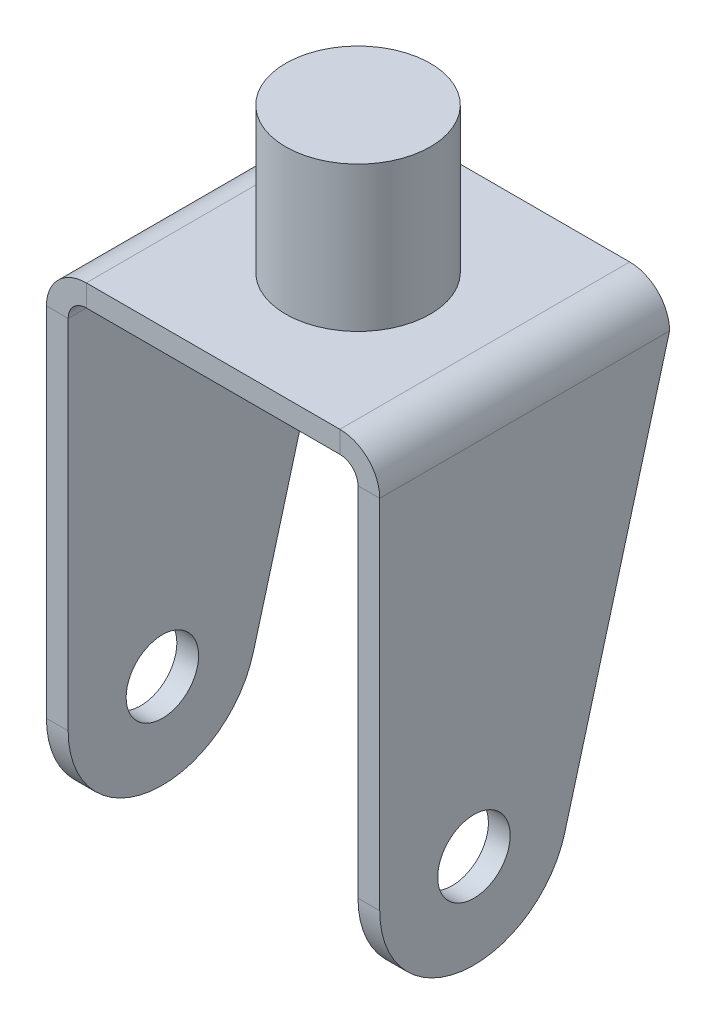
ISO-10303-21;
HEADER;
FILE_DESCRIPTION(('STEP AP214'),'2;1');
FILE_NAME('part.step','',(''),(''),'','','');
FILE_SCHEMA(('AUTOMOTIVE_DESIGN { 1 0 10303 214 1 1 1 1 }'));
ENDSEC;
DATA;
#1=APPLICATION_CONTEXT('core data for automotive mechanical design processes');
#2=APPLICATION_PROTOCOL_DEFINITION('international standard','automotive_design',2000,#1);
#3=PRODUCT_CONTEXT('',#1,'mechanical');
#4=PRODUCT('Part','Part','',(#3));
#5=PRODUCT_RELATED_PRODUCT_CATEGORY('part','',(#4));
#6=PRODUCT_DEFINITION_FORMATION('','',#4);
#7=PRODUCT_DEFINITION_CONTEXT('part definition',#1,'design');
#8=PRODUCT_DEFINITION('design','',#6,#7);
#9=PRODUCT_DEFINITION_SHAPE('','',#8);
#10=(LENGTH_UNIT() NAMED_UNIT(*) SI_UNIT(.MILLI.,.METRE.));
#11=(NAMED_UNIT(*) PLANE_ANGLE_UNIT() SI_UNIT($,.RADIAN.));
#12=(NAMED_UNIT(*) SI_UNIT($,.STERADIAN.) SOLID_ANGLE_UNIT());
#13=UNCERTAINTY_MEASURE_WITH_UNIT(LENGTH_MEASURE(1.E-05),#10,'distance_accuracy_value','');
#14=(GEOMETRIC_REPRESENTATION_CONTEXT(3) GLOBAL_UNCERTAINTY_ASSIGNED_CONTEXT((#13)) GLOBAL_UNIT_ASSIGNED_CONTEXT((#10,
#11,#12)) REPRESENTATION_CONTEXT('',''));
#15=CARTESIAN_POINT('',(0.,0.,0.));
#16=DIRECTION('',(0.,0.,1.));
#17=DIRECTION('',(1.,0.,0.));
#18=AXIS2_PLACEMENT_3D('',#15,#16,#17);
#19=CARTESIAN_POINT('',(50.8,0.,50.8));
#20=DIRECTION('',(1.,0.,0.));
#21=DIRECTION('',(0.,0.,-1.));
#22=AXIS2_PLACEMENT_3D('',#19,#20,#21);
#23=PLANE('',#22);
#24=CARTESIAN_POINT('',(50.8,33.02,17.78));
#25=DIRECTION('',(1.,0.,0.));
#26=DIRECTION('',(0.,0.,-1.));
#27=AXIS2_PLACEMENT_3D('',#24,#25,#26);
#28=CIRCLE('',#27,33.02);
#29=CARTESIAN_POINT('',(50.8,24.2870464916257,-14.0642447393649));
#30=VERTEX_POINT('',#29);
#31=CARTESIAN_POINT('',(50.8,33.02,50.8));
#32=VERTEX_POINT('',#31);
#33=EDGE_CURVE('E189',#30,#32,#28,.F.);
#34=ORIENTED_EDGE('',*,*,#33,.T.);
#35=DIRECTION('',(0.,-1.,0.));
#36=VECTOR('',#35,1.);
#37=CARTESIAN_POINT('',(50.8,0.,50.8));
#38=LINE('',#37,#36);
#39=CARTESIAN_POINT('',(50.8,158.242,50.8));
#40=VERTEX_POINT('',#39);
#41=EDGE_CURVE('E200',#40,#32,#38,.T.);
#42=ORIENTED_EDGE('',*,*,#41,.F.);
#43=DIRECTION('',(0.,0.,-1.));
#44=VECTOR('',#43,1.);
#45=CARTESIAN_POINT('',(50.8,158.242,50.8));
#46=LINE('',#45,#44);
#47=CARTESIAN_POINT('',(50.8,158.242,-50.8));
#48=VERTEX_POINT('',#47);
#49=EDGE_CURVE('E181',#40,#48,#46,.T.);
#50=ORIENTED_EDGE('',*,*,#49,.T.);
#51=DIRECTION('',(0.,-0.964392632930495,0.264474667122178));
#52=VECTOR('',#51,1.);
#53=CARTESIAN_POINT('',(50.8,-14.8453045634543,-3.33260374004345));
#54=LINE('',#53,#52);
#55=EDGE_CURVE('E281',#48,#30,#54,.T.);
#56=ORIENTED_EDGE('',*,*,#55,.T.);
#57=EDGE_LOOP('',(#34,#42,#50,#56));
#58=FACE_BOUND('',#57,.T.);
#59=CARTESIAN_POINT('',(50.8,33.02,17.78));
#60=DIRECTION('',(1.,0.,0.));
#61=DIRECTION('',(0.,0.,-1.));
#62=AXIS2_PLACEMENT_3D('',#59,#60,#61);
#63=CIRCLE('',#62,12.7);
#64=CARTESIAN_POINT('',(50.8,33.02,5.08000000000002));
#65=VERTEX_POINT('',#64);
#66=EDGE_CURVE('E260',#65,#65,#63,.T.);
#67=ORIENTED_EDGE('',*,*,#66,.T.);
#68=EDGE_LOOP('',(#67));
#69=FACE_BOUND('',#68,.T.);
#70=ADVANCED_FACE('F66',(#58,#69),#23,.F.);
#71=CARTESIAN_POINT('',(58.42,0.,50.8));
#72=DIRECTION('',(1.,0.,0.));
#73=DIRECTION('',(0.,0.,-1.));
#74=AXIS2_PLACEMENT_3D('',#71,#72,#73);
#75=PLANE('',#74);
#76=DIRECTION('',(0.,1.,0.));
#77=VECTOR('',#76,1.);
#78=CARTESIAN_POINT('',(58.42,0.,50.8));
#79=LINE('',#78,#77);
#80=CARTESIAN_POINT('',(58.42,158.242,50.8));
#81=VERTEX_POINT('',#80);
#82=CARTESIAN_POINT('',(58.42,33.02,50.8));
#83=VERTEX_POINT('',#82);
#84=EDGE_CURVE('E287',#81,#83,#79,.F.);
#85=ORIENTED_EDGE('',*,*,#84,.T.);
#86=CARTESIAN_POINT('',(58.42,33.02,17.78));
#87=DIRECTION('',(1.,0.,0.));
#88=DIRECTION('',(0.,0.,-1.));
#89=AXIS2_PLACEMENT_3D('',#86,#87,#88);
#90=CIRCLE('',#89,33.02);
#91=CARTESIAN_POINT('',(58.42,24.2870464916257,-14.0642447393649));
#92=VERTEX_POINT('',#91);
#93=EDGE_CURVE('E272',#92,#83,#90,.F.);
#94=ORIENTED_EDGE('',*,*,#93,.F.);
#95=DIRECTION('',(0.,-0.964392632930495,0.264474667122178));
#96=VECTOR('',#95,1.);
#97=CARTESIAN_POINT('',(58.42,-1.88838759853009,-6.8859036971523));
#98=LINE('',#97,#96);
#99=CARTESIAN_POINT('',(58.42,158.242,-50.8));
#100=VERTEX_POINT('',#99);
#101=EDGE_CURVE('E82',#100,#92,#98,.T.);
#102=ORIENTED_EDGE('',*,*,#101,.F.);
#103=DIRECTION('',(0.,0.,-1.));
#104=VECTOR('',#103,1.);
#105=CARTESIAN_POINT('',(58.42,158.242,50.8));
#106=LINE('',#105,#104);
#107=EDGE_CURVE('E214',#81,#100,#106,.T.);
#108=ORIENTED_EDGE('',*,*,#107,.F.);
#109=EDGE_LOOP('',(#85,#94,#102,#108));
#110=FACE_BOUND('',#109,.T.);
#111=CARTESIAN_POINT('',(58.42,33.02,17.78));
#112=DIRECTION('',(1.,0.,0.));
#113=DIRECTION('',(0.,0.,-1.));
#114=AXIS2_PLACEMENT_3D('',#111,#112,#113);
#115=CIRCLE('',#114,12.7);
#116=CARTESIAN_POINT('',(58.42,33.02,5.08000000000002));
#117=VERTEX_POINT('',#116);
#118=EDGE_CURVE('E262',#117,#117,#115,.T.);
#119=ORIENTED_EDGE('',*,*,#118,.F.);
#120=EDGE_LOOP('',(#119));
#121=FACE_BOUND('',#120,.T.);
#122=ADVANCED_FACE('F328',(#110,#121),#75,.T.);
#123=CARTESIAN_POINT('',(-58.42,0.,50.8));
#124=DIRECTION('',(-1.,0.,0.));
#125=DIRECTION('',(0.,0.,1.));
#126=AXIS2_PLACEMENT_3D('',#123,#124,#125);
#127=PLANE('',#126);
#128=CARTESIAN_POINT('',(-58.42,33.02,17.78));
#129=DIRECTION('',(1.,0.,0.));
#130=DIRECTION('',(0.,0.,-1.));
#131=AXIS2_PLACEMENT_3D('',#128,#129,#130);
#132=CIRCLE('',#131,33.02);
#133=CARTESIAN_POINT('',(-58.42,24.2870464916257,-14.0642447393649));
#134=VERTEX_POINT('',#133);
#135=CARTESIAN_POINT('',(-58.42,33.02,50.8));
#136=VERTEX_POINT('',#135);
#137=EDGE_CURVE('E271',#134,#136,#132,.F.);
#138=ORIENTED_EDGE('',*,*,#137,.T.);
#139=DIRECTION('',(0.,1.,0.));
#140=VECTOR('',#139,1.);
#141=CARTESIAN_POINT('',(-58.42,0.,50.8));
#142=LINE('',#141,#140);
#143=CARTESIAN_POINT('',(-58.42,158.242,50.8));
#144=VERTEX_POINT('',#143);
#145=EDGE_CURVE('E256',#136,#144,#142,.T.);
#146=ORIENTED_EDGE('',*,*,#145,.T.);
#147=DIRECTION('',(0.,0.,-1.));
#148=VECTOR('',#147,1.);
#149=CARTESIAN_POINT('',(-58.42,158.242,50.8));
#150=LINE('',#149,#148);
#151=CARTESIAN_POINT('',(-58.42,158.242,-50.8));
#152=VERTEX_POINT('',#151);
#153=EDGE_CURVE('E205',#144,#152,#150,.T.);
#154=ORIENTED_EDGE('',*,*,#153,.T.);
#155=DIRECTION('',(0.,-0.964392632930495,0.264474667122178));
#156=VECTOR('',#155,1.);
#157=CARTESIAN_POINT('',(-58.42,-1.88838759853009,-6.8859036971523));
#158=LINE('',#157,#156);
#159=EDGE_CURVE('E268',#152,#134,#158,.T.);
#160=ORIENTED_EDGE('',*,*,#159,.T.);
#161=EDGE_LOOP('',(#138,#146,#154,#160));
#162=FACE_BOUND('',#161,.T.);
#163=CARTESIAN_POINT('',(-58.42,33.02,17.78));
#164=DIRECTION('',(1.,0.,0.));
#165=DIRECTION('',(0.,0.,-1.));
#166=AXIS2_PLACEMENT_3D('',#163,#164,#165);
#167=CIRCLE('',#166,12.7);
#168=CARTESIAN_POINT('',(-58.42,33.02,5.08000000000002));
#169=VERTEX_POINT('',#168);
#170=EDGE_CURVE('E257',#169,#169,#167,.T.);
#171=ORIENTED_EDGE('',*,*,#170,.T.);
#172=EDGE_LOOP('',(#171));
#173=FACE_BOUND('',#172,.T.);
#174=ADVANCED_FACE('F297',(#162,#173),#127,.T.);
#175=CARTESIAN_POINT('',(-50.8,0.,50.8));
#176=DIRECTION('',(-1.,0.,0.));
#177=DIRECTION('',(0.,0.,1.));
#178=AXIS2_PLACEMENT_3D('',#175,#176,#177);
#179=PLANE('',#178);
#180=DIRECTION('',(0.,1.,0.));
#181=VECTOR('',#180,1.);
#182=CARTESIAN_POINT('',(-50.8,0.,50.8));
#183=LINE('',#182,#181);
#184=CARTESIAN_POINT('',(-50.8,33.02,50.8));
#185=VERTEX_POINT('',#184);
#186=CARTESIAN_POINT('',(-50.8,158.242,50.8));
#187=VERTEX_POINT('',#186);
#188=EDGE_CURVE('E164',#185,#187,#183,.T.);
#189=ORIENTED_EDGE('',*,*,#188,.F.);
#190=CARTESIAN_POINT('',(-50.8,33.02,17.78));
#191=DIRECTION('',(-1.,0.,0.));
#192=DIRECTION('',(0.,0.,1.));
#193=AXIS2_PLACEMENT_3D('',#190,#191,#192);
#194=CIRCLE('',#193,33.02);
#195=CARTESIAN_POINT('',(-50.8,24.2870464916257,-14.0642447393649));
#196=VERTEX_POINT('',#195);
#197=EDGE_CURVE('E75',#185,#196,#194,.F.);
#198=ORIENTED_EDGE('',*,*,#197,.T.);
#199=DIRECTION('',(0.,0.964392632930495,-0.264474667122178));
#200=VECTOR('',#199,1.);
#201=CARTESIAN_POINT('',(-50.8,-14.8453045634543,-3.33260374004345));
#202=LINE('',#201,#200);
#203=CARTESIAN_POINT('',(-50.8,158.242,-50.8));
#204=VERTEX_POINT('',#203);
#205=EDGE_CURVE('E238',#196,#204,#202,.T.);
#206=ORIENTED_EDGE('',*,*,#205,.T.);
#207=DIRECTION('',(0.,0.,-1.));
#208=VECTOR('',#207,1.);
#209=CARTESIAN_POINT('',(-50.8,158.242,50.8));
#210=LINE('',#209,#208);
#211=EDGE_CURVE('E173',#187,#204,#210,.T.);
#212=ORIENTED_EDGE('',*,*,#211,.F.);
#213=EDGE_LOOP('',(#189,#198,#206,#212));
#214=FACE_BOUND('',#213,.T.);
#215=CARTESIAN_POINT('',(-50.8,33.02,17.78));
#216=DIRECTION('',(-1.,0.,0.));
#217=DIRECTION('',(0.,0.,1.));
#218=AXIS2_PLACEMENT_3D('',#215,#216,#217);
#219=CIRCLE('',#218,12.7);
#220=CARTESIAN_POINT('',(-50.8,33.02,30.48));
#221=VERTEX_POINT('',#220);
#222=EDGE_CURVE('E70',#221,#221,#219,.T.);
#223=ORIENTED_EDGE('',*,*,#222,.T.);
#224=EDGE_LOOP('',(#223));
#225=FACE_BOUND('',#224,.T.);
#226=ADVANCED_FACE('F234',(#214,#225),#179,.F.);
#227=CARTESIAN_POINT('',(44.45,164.592,50.8));
#228=DIRECTION('',(0.,0.,1.));
#229=DIRECTION('',(1.,0.,0.));
#230=AXIS2_PLACEMENT_3D('',#227,#228,#229);
#231=PLANE('',#230);
#232=DIRECTION('',(0.,1.,0.));
#233=VECTOR('',#232,1.);
#234=CARTESIAN_POINT('',(44.45,164.592,50.8));
#235=LINE('',#234,#233);
#236=CARTESIAN_POINT('',(44.45,164.592,50.8));
#237=VERTEX_POINT('',#236);
#238=CARTESIAN_POINT('',(44.45,172.212,50.8));
#239=VERTEX_POINT('',#238);
#240=EDGE_CURVE('E226',#237,#239,#235,.T.);
#241=ORIENTED_EDGE('',*,*,#240,.F.);
#242=CARTESIAN_POINT('',(44.45,158.242,50.8));
#243=DIRECTION('',(0.,0.,-1.));
#244=DIRECTION('',(-1.,0.,0.));
#245=AXIS2_PLACEMENT_3D('',#242,#243,#244);
#246=CIRCLE('',#245,6.35);
#247=EDGE_CURVE('E179',#237,#40,#246,.T.);
#248=ORIENTED_EDGE('',*,*,#247,.T.);
#249=DIRECTION('',(-1.,0.,0.));
#250=VECTOR('',#249,1.);
#251=CARTESIAN_POINT('',(58.42,158.242,50.8));
#252=LINE('',#251,#250);
#253=EDGE_CURVE('E91',#81,#40,#252,.T.);
#254=ORIENTED_EDGE('',*,*,#253,.F.);
#255=CARTESIAN_POINT('',(44.45,158.242,50.8));
#256=DIRECTION('',(0.,0.,1.));
#257=DIRECTION('',(1.,0.,0.));
#258=AXIS2_PLACEMENT_3D('',#255,#256,#257);
#259=CIRCLE('',#258,13.97);
#260=EDGE_CURVE('E290',#239,#81,#259,.F.);
#261=ORIENTED_EDGE('',*,*,#260,.F.);
#262=EDGE_LOOP('',(#241,#248,#254,#261));
#263=FACE_BOUND('',#262,.T.);
#264=ADVANCED_FACE('F68',(#263),#231,.T.);
#265=CARTESIAN_POINT('',(58.42,158.242,50.8));
#266=DIRECTION('',(0.,0.,1.));
#267=DIRECTION('',(1.,0.,0.));
#268=AXIS2_PLACEMENT_3D('',#265,#266,#267);
#269=PLANE('',#268);
#270=DIRECTION('',(1.,0.,0.));
#271=VECTOR('',#270,1.);
#272=CARTESIAN_POINT('',(50.8,164.592,50.8));
#273=LINE('',#272,#271);
#274=CARTESIAN_POINT('',(-44.45,164.592,50.8));
#275=VERTEX_POINT('',#274);
#276=EDGE_CURVE('E144',#275,#237,#273,.T.);
#277=ORIENTED_EDGE('',*,*,#276,.T.);
#278=ORIENTED_EDGE('',*,*,#240,.T.);
#279=DIRECTION('',(1.,0.,0.));
#280=VECTOR('',#279,1.);
#281=CARTESIAN_POINT('',(50.8,172.212,50.8));
#282=LINE('',#281,#280);
#283=CARTESIAN_POINT('',(-44.45,172.212,50.8));
#284=VERTEX_POINT('',#283);
#285=EDGE_CURVE('E147',#284,#239,#282,.T.);
#286=ORIENTED_EDGE('',*,*,#285,.F.);
#287=DIRECTION('',(0.,-1.,0.));
#288=VECTOR('',#287,1.);
#289=CARTESIAN_POINT('',(-44.45,172.212,50.8));
#290=LINE('',#289,#288);
#291=EDGE_CURVE('E140',#284,#275,#290,.T.);
#292=ORIENTED_EDGE('',*,*,#291,.T.);
#293=EDGE_LOOP('',(#277,#278,#286,#292));
#294=FACE_BOUND('',#293,.T.);
#295=ADVANCED_FACE('F142',(#294),#269,.T.);
#296=CARTESIAN_POINT('',(50.8,158.242,-50.8));
#297=DIRECTION('',(0.,0.,-1.));
#298=DIRECTION('',(-1.,0.,0.));
#299=AXIS2_PLACEMENT_3D('',#296,#297,#298);
#300=PLANE('',#299);
#301=DIRECTION('',(1.,0.,0.));
#302=VECTOR('',#301,1.);
#303=CARTESIAN_POINT('',(50.8,158.242,-50.8));
#304=LINE('',#303,#302);
#305=EDGE_CURVE('E223',#48,#100,#304,.T.);
#306=ORIENTED_EDGE('',*,*,#305,.F.);
#307=CARTESIAN_POINT('',(44.45,158.242,-50.8));
#308=DIRECTION('',(0.,0.,-1.));
#309=DIRECTION('',(-1.,0.,0.));
#310=AXIS2_PLACEMENT_3D('',#307,#308,#309);
#311=CIRCLE('',#310,6.35);
#312=CARTESIAN_POINT('',(44.45,164.592,-50.8));
#313=VERTEX_POINT('',#312);
#314=EDGE_CURVE('E197',#313,#48,#311,.T.);
#315=ORIENTED_EDGE('',*,*,#314,.F.);
#316=DIRECTION('',(0.,-1.,0.));
#317=VECTOR('',#316,1.);
#318=CARTESIAN_POINT('',(44.45,172.212,-50.8));
#319=LINE('',#318,#317);
#320=CARTESIAN_POINT('',(44.45,172.212,-50.8));
#321=VERTEX_POINT('',#320);
#322=EDGE_CURVE('E116',#321,#313,#319,.T.);
#323=ORIENTED_EDGE('',*,*,#322,.F.);
#324=CARTESIAN_POINT('',(44.45,158.242,-50.8));
#325=DIRECTION('',(0.,0.,1.));
#326=DIRECTION('',(1.,0.,0.));
#327=AXIS2_PLACEMENT_3D('',#324,#325,#326);
#328=CIRCLE('',#327,13.97);
#329=EDGE_CURVE('E185',#321,#100,#328,.F.);
#330=ORIENTED_EDGE('',*,*,#329,.T.);
#331=EDGE_LOOP('',(#306,#315,#323,#330));
#332=FACE_BOUND('',#331,.T.);
#333=ADVANCED_FACE('F336',(#332),#300,.T.);
#334=CARTESIAN_POINT('',(-50.8,158.242,50.8));
#335=DIRECTION('',(0.,0.,1.));
#336=DIRECTION('',(1.,0.,0.));
#337=AXIS2_PLACEMENT_3D('',#334,#335,#336);
#338=PLANE('',#337);
#339=DIRECTION('',(-1.,0.,0.));
#340=VECTOR('',#339,1.);
#341=CARTESIAN_POINT('',(-50.8,158.242,50.8));
#342=LINE('',#341,#340);
#343=EDGE_CURVE('E152',#187,#144,#342,.T.);
#344=ORIENTED_EDGE('',*,*,#343,.F.);
#345=CARTESIAN_POINT('',(-44.45,158.242,50.8));
#346=DIRECTION('',(0.,0.,-1.));
#347=DIRECTION('',(-1.,0.,0.));
#348=AXIS2_PLACEMENT_3D('',#345,#346,#347);
#349=CIRCLE('',#348,6.35);
#350=EDGE_CURVE('E157',#187,#275,#349,.T.);
#351=ORIENTED_EDGE('',*,*,#350,.T.);
#352=ORIENTED_EDGE('',*,*,#291,.F.);
#353=CARTESIAN_POINT('',(-44.45,158.242,50.8));
#354=DIRECTION('',(0.,0.,1.));
#355=DIRECTION('',(1.,0.,0.));
#356=AXIS2_PLACEMENT_3D('',#353,#354,#355);
#357=CIRCLE('',#356,13.97);
#358=EDGE_CURVE('E294',#144,#284,#357,.F.);
#359=ORIENTED_EDGE('',*,*,#358,.F.);
#360=EDGE_LOOP('',(#344,#351,#352,#359));
#361=FACE_BOUND('',#360,.T.);
#362=ADVANCED_FACE('F159',(#361),#338,.T.);
#363=CARTESIAN_POINT('',(-44.45,172.212,50.8));
#364=DIRECTION('',(0.,0.,1.));
#365=DIRECTION('',(1.,0.,0.));
#366=AXIS2_PLACEMENT_3D('',#363,#364,#365);
#367=PLANE('',#366);
#368=DIRECTION('',(1.,0.,0.));
#369=VECTOR('',#368,1.);
#370=CARTESIAN_POINT('',(-58.42,33.02,50.8));
#371=LINE('',#370,#369);
#372=EDGE_CURVE('E248',#136,#185,#371,.T.);
#373=ORIENTED_EDGE('',*,*,#372,.T.);
#374=ORIENTED_EDGE('',*,*,#188,.T.);
#375=ORIENTED_EDGE('',*,*,#343,.T.);
#376=ORIENTED_EDGE('',*,*,#145,.F.);
#377=EDGE_LOOP('',(#373,#374,#375,#376));
#378=FACE_BOUND('',#377,.T.);
#379=ADVANCED_FACE('F255',(#378),#367,.T.);
#380=CARTESIAN_POINT('',(-44.45,164.592,-50.8));
#381=DIRECTION('',(0.,0.,-1.));
#382=DIRECTION('',(-1.,0.,0.));
#383=AXIS2_PLACEMENT_3D('',#380,#381,#382);
#384=PLANE('',#383);
#385=DIRECTION('',(0.,1.,0.));
#386=VECTOR('',#385,1.);
#387=CARTESIAN_POINT('',(-44.45,164.592,-50.8));
#388=LINE('',#387,#386);
#389=CARTESIAN_POINT('',(-44.45,164.592,-50.8));
#390=VERTEX_POINT('',#389);
#391=CARTESIAN_POINT('',(-44.45,172.212,-50.8));
#392=VERTEX_POINT('',#391);
#393=EDGE_CURVE('E153',#390,#392,#388,.T.);
#394=ORIENTED_EDGE('',*,*,#393,.F.);
#395=CARTESIAN_POINT('',(-44.45,158.242,-50.8));
#396=DIRECTION('',(0.,0.,-1.));
#397=DIRECTION('',(-1.,0.,0.));
#398=AXIS2_PLACEMENT_3D('',#395,#396,#397);
#399=CIRCLE('',#398,6.35);
#400=EDGE_CURVE('E171',#204,#390,#399,.T.);
#401=ORIENTED_EDGE('',*,*,#400,.F.);
#402=DIRECTION('',(1.,0.,0.));
#403=VECTOR('',#402,1.);
#404=CARTESIAN_POINT('',(-58.42,158.242,-50.8));
#405=LINE('',#404,#403);
#406=EDGE_CURVE('E217',#152,#204,#405,.T.);
#407=ORIENTED_EDGE('',*,*,#406,.F.);
#408=CARTESIAN_POINT('',(-44.45,158.242,-50.8));
#409=DIRECTION('',(0.,0.,1.));
#410=DIRECTION('',(1.,0.,0.));
#411=AXIS2_PLACEMENT_3D('',#408,#409,#410);
#412=CIRCLE('',#411,13.97);
#413=EDGE_CURVE('E191',#152,#392,#412,.F.);
#414=ORIENTED_EDGE('',*,*,#413,.T.);
#415=EDGE_LOOP('',(#394,#401,#407,#414));
#416=FACE_BOUND('',#415,.T.);
#417=ADVANCED_FACE('F306',(#416),#384,.T.);
#418=CARTESIAN_POINT('',(-58.42,158.242,-50.8));
#419=DIRECTION('',(0.,0.,-1.));
#420=DIRECTION('',(-1.,0.,0.));
#421=AXIS2_PLACEMENT_3D('',#418,#419,#420);
#422=PLANE('',#421);
#423=DIRECTION('',(1.,0.,0.));
#424=VECTOR('',#423,1.);
#425=CARTESIAN_POINT('',(50.8,164.592,-50.8));
#426=LINE('',#425,#424);
#427=EDGE_CURVE('E195',#390,#313,#426,.T.);
#428=ORIENTED_EDGE('',*,*,#427,.F.);
#429=ORIENTED_EDGE('',*,*,#393,.T.);
#430=DIRECTION('',(1.,0.,0.));
#431=VECTOR('',#430,1.);
#432=CARTESIAN_POINT('',(50.8,172.212,-50.8));
#433=LINE('',#432,#431);
#434=EDGE_CURVE('E188',#392,#321,#433,.T.);
#435=ORIENTED_EDGE('',*,*,#434,.T.);
#436=ORIENTED_EDGE('',*,*,#322,.T.);
#437=EDGE_LOOP('',(#428,#429,#435,#436));
#438=FACE_BOUND('',#437,.T.);
#439=ADVANCED_FACE('F367',(#438),#422,.T.);
#440=CARTESIAN_POINT('',(44.45,158.242,50.8));
#441=DIRECTION('',(0.,0.,-1.));
#442=DIRECTION('',(-1.,0.,0.));
#443=AXIS2_PLACEMENT_3D('',#440,#441,#442);
#444=CYLINDRICAL_SURFACE('',#443,13.97);
#445=ORIENTED_EDGE('',*,*,#329,.F.);
#446=DIRECTION('',(0.,0.,-1.));
#447=VECTOR('',#446,1.);
#448=CARTESIAN_POINT('',(44.45,172.212,50.8));
#449=LINE('',#448,#447);
#450=EDGE_CURVE('E211',#239,#321,#449,.T.);
#451=ORIENTED_EDGE('',*,*,#450,.F.);
#452=ORIENTED_EDGE('',*,*,#260,.T.);
#453=ORIENTED_EDGE('',*,*,#107,.T.);
#454=EDGE_LOOP('',(#445,#451,#452,#453));
#455=FACE_BOUND('',#454,.T.);
#456=ADVANCED_FACE('F332',(#455),#444,.T.);
#457=CARTESIAN_POINT('',(50.8,172.212,50.8));
#458=DIRECTION('',(0.,1.,0.));
#459=DIRECTION('',(0.,0.,1.));
#460=AXIS2_PLACEMENT_3D('',#457,#458,#459);
#461=PLANE('',#460);
#462=CARTESIAN_POINT('',(0.,172.212,0.));
#463=DIRECTION('',(0.,1.,0.));
#464=DIRECTION('',(0.,0.,1.));
#465=AXIS2_PLACEMENT_3D('',#462,#463,#464);
#466=CIRCLE('',#465,25.361825220135);
#467=CARTESIAN_POINT('',(0.,172.212,25.361825220135));
#468=VERTEX_POINT('',#467);
#469=EDGE_CURVE('E493',#468,#468,#466,.T.);
#470=ORIENTED_EDGE('',*,*,#469,.F.);
#471=EDGE_LOOP('',(#470));
#472=FACE_BOUND('',#471,.T.);
#473=ORIENTED_EDGE('',*,*,#434,.F.);
#474=DIRECTION('',(0.,0.,-1.));
#475=VECTOR('',#474,1.);
#476=CARTESIAN_POINT('',(-44.45,172.212,50.8));
#477=LINE('',#476,#475);
#478=EDGE_CURVE('E208',#284,#392,#477,.T.);
#479=ORIENTED_EDGE('',*,*,#478,.F.);
#480=ORIENTED_EDGE('',*,*,#285,.T.);
#481=ORIENTED_EDGE('',*,*,#450,.T.);
#482=EDGE_LOOP('',(#473,#479,#480,#481));
#483=FACE_BOUND('',#482,.T.);
#484=ADVANCED_FACE('F339',(#472,#483),#461,.T.);
#485=CARTESIAN_POINT('',(-44.45,158.242,50.8));
#486=DIRECTION('',(0.,0.,-1.));
#487=DIRECTION('',(-1.,0.,0.));
#488=AXIS2_PLACEMENT_3D('',#485,#486,#487);
#489=CYLINDRICAL_SURFACE('',#488,13.97);
#490=ORIENTED_EDGE('',*,*,#413,.F.);
#491=ORIENTED_EDGE('',*,*,#153,.F.);
#492=ORIENTED_EDGE('',*,*,#358,.T.);
#493=ORIENTED_EDGE('',*,*,#478,.T.);
#494=EDGE_LOOP('',(#490,#491,#492,#493));
#495=FACE_BOUND('',#494,.T.);
#496=ADVANCED_FACE('F302',(#495),#489,.T.);
#497=CARTESIAN_POINT('',(-44.45,158.242,50.8));
#498=DIRECTION('',(0.,0.,-1.));
#499=DIRECTION('',(-1.,0.,0.));
#500=AXIS2_PLACEMENT_3D('',#497,#498,#499);
#501=CYLINDRICAL_SURFACE('',#500,6.35);
#502=ORIENTED_EDGE('',*,*,#400,.T.);
#503=DIRECTION('',(0.,0.,-1.));
#504=VECTOR('',#503,1.);
#505=CARTESIAN_POINT('',(-44.45,164.592,50.8));
#506=LINE('',#505,#504);
#507=EDGE_CURVE('E168',#275,#390,#506,.T.);
#508=ORIENTED_EDGE('',*,*,#507,.F.);
#509=ORIENTED_EDGE('',*,*,#350,.F.);
#510=ORIENTED_EDGE('',*,*,#211,.T.);
#511=EDGE_LOOP('',(#502,#508,#509,#510));
#512=FACE_BOUND('',#511,.T.);
#513=ADVANCED_FACE('F169',(#512),#501,.F.);
#514=CARTESIAN_POINT('',(50.8,164.592,50.8));
#515=DIRECTION('',(0.,1.,0.));
#516=DIRECTION('',(0.,0.,1.));
#517=AXIS2_PLACEMENT_3D('',#514,#515,#516);
#518=PLANE('',#517);
#519=ORIENTED_EDGE('',*,*,#427,.T.);
#520=DIRECTION('',(0.,0.,-1.));
#521=VECTOR('',#520,1.);
#522=CARTESIAN_POINT('',(44.45,164.592,50.8));
#523=LINE('',#522,#521);
#524=EDGE_CURVE('E174',#237,#313,#523,.T.);
#525=ORIENTED_EDGE('',*,*,#524,.F.);
#526=ORIENTED_EDGE('',*,*,#276,.F.);
#527=ORIENTED_EDGE('',*,*,#507,.T.);
#528=EDGE_LOOP('',(#519,#525,#526,#527));
#529=FACE_BOUND('',#528,.T.);
#530=ADVANCED_FACE('F176',(#529),#518,.F.);
#531=CARTESIAN_POINT('',(44.45,158.242,50.8));
#532=DIRECTION('',(0.,0.,-1.));
#533=DIRECTION('',(-1.,0.,0.));
#534=AXIS2_PLACEMENT_3D('',#531,#532,#533);
#535=CYLINDRICAL_SURFACE('',#534,6.35);
#536=ORIENTED_EDGE('',*,*,#314,.T.);
#537=ORIENTED_EDGE('',*,*,#49,.F.);
#538=ORIENTED_EDGE('',*,*,#247,.F.);
#539=ORIENTED_EDGE('',*,*,#524,.T.);
#540=EDGE_LOOP('',(#536,#537,#538,#539));
#541=FACE_BOUND('',#540,.T.);
#542=ADVANCED_FACE('F342',(#541),#535,.F.);
#543=CARTESIAN_POINT('',(44.45,158.242,50.8));
#544=DIRECTION('',(0.,0.,1.));
#545=DIRECTION('',(1.,0.,0.));
#546=AXIS2_PLACEMENT_3D('',#543,#544,#545);
#547=PLANE('',#546);
#548=DIRECTION('',(1.,0.,0.));
#549=VECTOR('',#548,1.);
#550=CARTESIAN_POINT('',(-58.42,33.02,50.8));
#551=LINE('',#550,#549);
#552=EDGE_CURVE('E12',#83,#32,#551,.F.);
#553=ORIENTED_EDGE('',*,*,#552,.F.);
#554=ORIENTED_EDGE('',*,*,#84,.F.);
#555=ORIENTED_EDGE('',*,*,#253,.T.);
#556=ORIENTED_EDGE('',*,*,#41,.T.);
#557=EDGE_LOOP('',(#553,#554,#555,#556));
#558=FACE_BOUND('',#557,.T.);
#559=ADVANCED_FACE('F326',(#558),#547,.T.);
#560=CARTESIAN_POINT('',(-58.42,-1.88838759853009,-6.8859036971523));
#561=DIRECTION('',(0.,0.264474667122178,0.964392632930495));
#562=DIRECTION('',(0.,-0.964392632930495,0.264474667122178));
#563=AXIS2_PLACEMENT_3D('',#560,#561,#562);
#564=PLANE('',#563);
#565=DIRECTION('',(1.,0.,0.));
#566=VECTOR('',#565,1.);
#567=CARTESIAN_POINT('',(-58.42,24.2870464916257,-14.0642447393649));
#568=LINE('',#567,#566);
#569=EDGE_CURVE('E251',#134,#196,#568,.T.);
#570=ORIENTED_EDGE('',*,*,#569,.F.);
#571=ORIENTED_EDGE('',*,*,#159,.F.);
#572=ORIENTED_EDGE('',*,*,#406,.T.);
#573=ORIENTED_EDGE('',*,*,#205,.F.);
#574=EDGE_LOOP('',(#570,#571,#572,#573));
#575=FACE_BOUND('',#574,.T.);
#576=ADVANCED_FACE('F308',(#575),#564,.F.);
#577=CARTESIAN_POINT('',(-58.42,33.02,17.78));
#578=DIRECTION('',(1.,0.,0.));
#579=DIRECTION('',(0.,0.,-1.));
#580=AXIS2_PLACEMENT_3D('',#577,#578,#579);
#581=CYLINDRICAL_SURFACE('',#580,33.02);
#582=ORIENTED_EDGE('',*,*,#197,.F.);
#583=ORIENTED_EDGE('',*,*,#372,.F.);
#584=ORIENTED_EDGE('',*,*,#137,.F.);
#585=ORIENTED_EDGE('',*,*,#569,.T.);
#586=EDGE_LOOP('',(#582,#583,#584,#585));
#587=FACE_BOUND('',#586,.T.);
#588=ADVANCED_FACE('F245',(#587),#581,.T.);
#589=EDGE_CURVE('E275',#30,#92,#568,.T.);
#590=ORIENTED_EDGE('',*,*,#589,.T.);
#591=ORIENTED_EDGE('',*,*,#93,.T.);
#592=ORIENTED_EDGE('',*,*,#552,.T.);
#593=ORIENTED_EDGE('',*,*,#33,.F.);
#594=EDGE_LOOP('',(#590,#591,#592,#593));
#595=FACE_BOUND('',#594,.T.);
#596=ADVANCED_FACE('F323',(#595),#581,.T.);
#597=ORIENTED_EDGE('',*,*,#305,.T.);
#598=ORIENTED_EDGE('',*,*,#101,.T.);
#599=ORIENTED_EDGE('',*,*,#589,.F.);
#600=ORIENTED_EDGE('',*,*,#55,.F.);
#601=EDGE_LOOP('',(#597,#598,#599,#600));
#602=FACE_BOUND('',#601,.T.);
#603=ADVANCED_FACE('F345',(#602),#564,.F.);
#604=CARTESIAN_POINT('',(-58.42,33.02,17.78));
#605=DIRECTION('',(1.,0.,0.));
#606=DIRECTION('',(0.,0.,-1.));
#607=AXIS2_PLACEMENT_3D('',#604,#605,#606);
#608=CYLINDRICAL_SURFACE('',#607,12.7);
#609=ORIENTED_EDGE('',*,*,#170,.F.);
#610=EDGE_LOOP('',(#609));
#611=FACE_BOUND('',#610,.T.);
#612=ORIENTED_EDGE('',*,*,#222,.F.);
#613=EDGE_LOOP('',(#612));
#614=FACE_BOUND('',#613,.T.);
#615=ADVANCED_FACE('F347',(#611,#614),#608,.F.);
#616=ORIENTED_EDGE('',*,*,#118,.T.);
#617=EDGE_LOOP('',(#616));
#618=FACE_BOUND('',#617,.T.);
#619=ORIENTED_EDGE('',*,*,#66,.F.);
#620=EDGE_LOOP('',(#619));
#621=FACE_BOUND('',#620,.T.);
#622=ADVANCED_FACE('F353',(#618,#621),#608,.F.);
#623=CARTESIAN_POINT('',(0.,223.012,0.));
#624=DIRECTION('',(0.,-1.,0.));
#625=DIRECTION('',(0.,0.,-1.));
#626=AXIS2_PLACEMENT_3D('',#623,#624,#625);
#627=CYLINDRICAL_SURFACE('',#626,25.361825220135);
#628=CARTESIAN_POINT('',(0.,223.012,0.));
#629=DIRECTION('',(0.,1.,0.));
#630=DIRECTION('',(0.,0.,1.));
#631=AXIS2_PLACEMENT_3D('',#628,#629,#630);
#632=CIRCLE('',#631,25.361825220135);
#633=CARTESIAN_POINT('',(0.,223.012,25.361825220135));
#634=VERTEX_POINT('',#633);
#635=EDGE_CURVE('E492',#634,#634,#632,.T.);
#636=ORIENTED_EDGE('',*,*,#635,.F.);
#637=EDGE_LOOP('',(#636));
#638=FACE_BOUND('',#637,.T.);
#639=ORIENTED_EDGE('',*,*,#469,.T.);
#640=EDGE_LOOP('',(#639));
#641=FACE_BOUND('',#640,.T.);
#642=ADVANCED_FACE('F466',(#638,#641),#627,.T.);
#643=CARTESIAN_POINT('',(0.,223.012,0.));
#644=DIRECTION('',(0.,1.,0.));
#645=DIRECTION('',(0.,0.,1.));
#646=AXIS2_PLACEMENT_3D('',#643,#644,#645);
#647=PLANE('',#646);
#648=ORIENTED_EDGE('',*,*,#635,.T.);
#649=EDGE_LOOP('',(#648));
#650=FACE_BOUND('',#649,.T.);
#651=ADVANCED_FACE('F476',(#650),#647,.T.);
#652=CLOSED_SHELL('',(#70,#122,#174,#226,#264,#295,#333,#362,#379,#417,#439,#456,#484,#496,#513,
#530,#542,#559,#576,#588,#596,#603,#615,#622,#642,#651));
#653=MANIFOLD_SOLID_BREP('B2',#652);
#654=ADVANCED_BREP_SHAPE_REPRESENTATION('',(#18,#653),#14);
#655=SHAPE_DEFINITION_REPRESENTATION(#9,#654);
ENDSEC;
END-ISO-10303-21;
